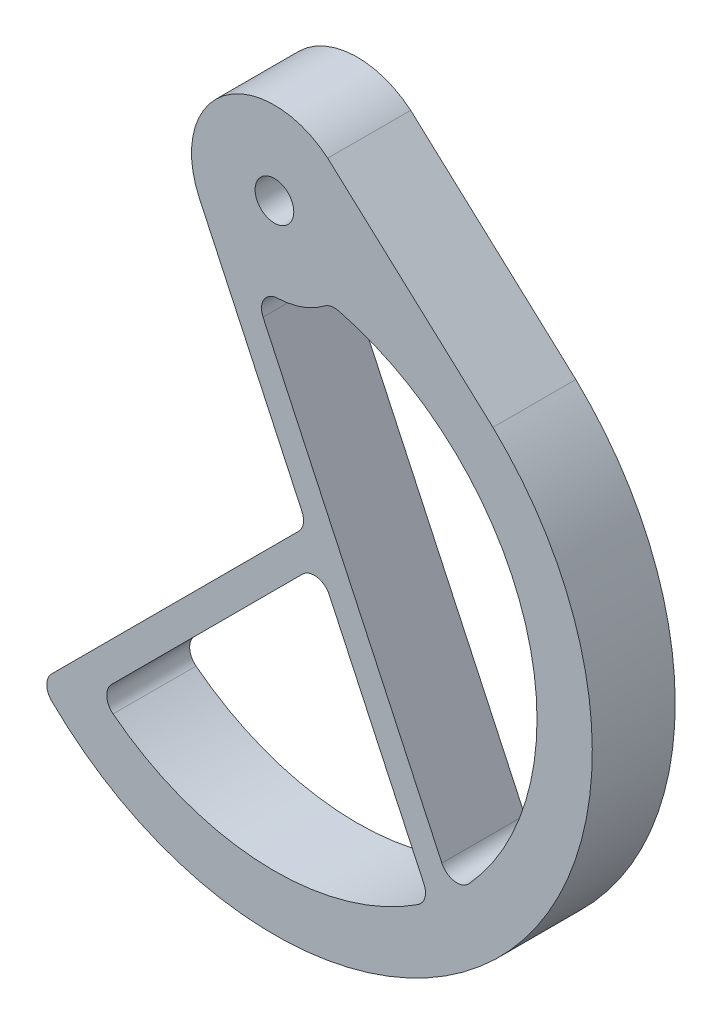
ISO-10303-21;
HEADER;
FILE_DESCRIPTION(('STEP AP214'),'2;1');
FILE_NAME('part.step','',(''),(''),'','','');
FILE_SCHEMA(('AUTOMOTIVE_DESIGN { 1 0 10303 214 1 1 1 1 }'));
ENDSEC;
DATA;
#1=APPLICATION_CONTEXT('core data for automotive mechanical design processes');
#2=APPLICATION_PROTOCOL_DEFINITION('international standard','automotive_design',2000,#1);
#3=PRODUCT_CONTEXT('',#1,'mechanical');
#4=PRODUCT('Part','Part','',(#3));
#5=PRODUCT_RELATED_PRODUCT_CATEGORY('part','',(#4));
#6=PRODUCT_DEFINITION_FORMATION('','',#4);
#7=PRODUCT_DEFINITION_CONTEXT('part definition',#1,'design');
#8=PRODUCT_DEFINITION('design','',#6,#7);
#9=PRODUCT_DEFINITION_SHAPE('','',#8);
#10=(LENGTH_UNIT() NAMED_UNIT(*) SI_UNIT(.MILLI.,.METRE.));
#11=(NAMED_UNIT(*) PLANE_ANGLE_UNIT() SI_UNIT($,.RADIAN.));
#12=(NAMED_UNIT(*) SI_UNIT($,.STERADIAN.) SOLID_ANGLE_UNIT());
#13=UNCERTAINTY_MEASURE_WITH_UNIT(LENGTH_MEASURE(1.E-05),#10,'distance_accuracy_value','');
#14=(GEOMETRIC_REPRESENTATION_CONTEXT(3) GLOBAL_UNCERTAINTY_ASSIGNED_CONTEXT((#13)) GLOBAL_UNIT_ASSIGNED_CONTEXT((#10,
#11,#12)) REPRESENTATION_CONTEXT('',''));
#15=CARTESIAN_POINT('',(0.,0.,0.));
#16=DIRECTION('',(0.,0.,1.));
#17=DIRECTION('',(1.,0.,0.));
#18=AXIS2_PLACEMENT_3D('',#15,#16,#17);
#19=CARTESIAN_POINT('',(0.,57.5,0.));
#20=DIRECTION('',(0.,0.,1.));
#21=DIRECTION('',(1.,0.,0.));
#22=AXIS2_PLACEMENT_3D('',#19,#20,#21);
#23=CYLINDRICAL_SURFACE('',#22,3.5);
#24=CARTESIAN_POINT('',(0.,57.5,15.));
#25=DIRECTION('',(0.,0.,1.));
#26=DIRECTION('',(1.,0.,0.));
#27=AXIS2_PLACEMENT_3D('',#24,#25,#26);
#28=CIRCLE('',#27,3.5);
#29=CARTESIAN_POINT('',(3.5,57.5,15.));
#30=VERTEX_POINT('',#29);
#31=EDGE_CURVE('E203',#30,#30,#28,.T.);
#32=ORIENTED_EDGE('',*,*,#31,.T.);
#33=EDGE_LOOP('',(#32));
#34=FACE_BOUND('',#33,.T.);
#35=CARTESIAN_POINT('',(0.,57.5,2.));
#36=DIRECTION('',(0.,0.,-1.));
#37=DIRECTION('',(-1.,0.,0.));
#38=AXIS2_PLACEMENT_3D('',#35,#36,#37);
#39=CIRCLE('',#38,3.5);
#40=CARTESIAN_POINT('',(-3.5,57.5,2.));
#41=VERTEX_POINT('',#40);
#42=EDGE_CURVE('E37',#41,#41,#39,.F.);
#43=ORIENTED_EDGE('',*,*,#42,.F.);
#44=EDGE_LOOP('',(#43));
#45=FACE_BOUND('',#44,.T.);
#46=ADVANCED_FACE('F33',(#34,#45),#23,.F.);
#47=CARTESIAN_POINT('',(8.4291609341208,3.93058229540153,15.));
#48=DIRECTION('',(0.906307787036647,0.422618261740705,0.));
#49=DIRECTION('',(-0.422618261740705,0.906307787036647,0.));
#50=AXIS2_PLACEMENT_3D('',#47,#48,#49);
#51=PLANE('',#50);
#52=DIRECTION('',(0.422618261740705,-0.906307787036647,0.));
#53=VECTOR('',#52,1.);
#54=CARTESIAN_POINT('',(8.4291609341208,3.93058229540153,0.));
#55=LINE('',#54,#53);
#56=CARTESIAN_POINT('',(-13.5946168055502,51.1607260738895,0.));
#57=VERTEX_POINT('',#56);
#58=CARTESIAN_POINT('',(4.98643209632603,11.3135381134901,0.));
#59=VERTEX_POINT('',#58);
#60=EDGE_CURVE('E233',#57,#59,#55,.T.);
#61=ORIENTED_EDGE('',*,*,#60,.T.);
#62=DIRECTION('',(0.,0.,-1.));
#63=VECTOR('',#62,1.);
#64=CARTESIAN_POINT('',(4.98643209632603,11.3135381134901,15.));
#65=LINE('',#64,#63);
#66=CARTESIAN_POINT('',(4.98643209632603,11.3135381134901,15.));
#67=VERTEX_POINT('',#66);
#68=EDGE_CURVE('E11',#67,#59,#65,.T.);
#69=ORIENTED_EDGE('',*,*,#68,.F.);
#70=DIRECTION('',(0.422618261740705,-0.906307787036647,0.));
#71=VECTOR('',#70,1.);
#72=CARTESIAN_POINT('',(8.4291609341208,3.93058229540153,15.));
#73=LINE('',#72,#71);
#74=CARTESIAN_POINT('',(-13.5946168055502,51.1607260738895,15.));
#75=VERTEX_POINT('',#74);
#76=EDGE_CURVE('E332',#75,#67,#73,.T.);
#77=ORIENTED_EDGE('',*,*,#76,.F.);
#78=DIRECTION('',(0.,0.,-1.));
#79=VECTOR('',#78,1.);
#80=CARTESIAN_POINT('',(-13.5946168055502,51.1607260738895,15.));
#81=LINE('',#80,#79);
#82=EDGE_CURVE('E247',#75,#57,#81,.T.);
#83=ORIENTED_EDGE('',*,*,#82,.T.);
#84=EDGE_LOOP('',(#61,#69,#77,#83));
#85=FACE_BOUND('',#84,.T.);
#86=ADVANCED_FACE('F350',(#85),#51,.F.);
#87=CARTESIAN_POINT('',(2.26750873521609,10.045683328268,15.));
#88=DIRECTION('',(0.,0.,-1.));
#89=DIRECTION('',(-1.,0.,0.));
#90=AXIS2_PLACEMENT_3D('',#87,#88,#89);
#91=CYLINDRICAL_SURFACE('',#90,3.);
#92=CARTESIAN_POINT('',(2.26750873521609,10.045683328268,0.));
#93=DIRECTION('',(0.,0.,1.));
#94=DIRECTION('',(1.,0.,0.));
#95=AXIS2_PLACEMENT_3D('',#92,#93,#94);
#96=CIRCLE('',#95,3.);
#97=CARTESIAN_POINT('',(4.38882907877573,7.92436298470834,0.));
#98=VERTEX_POINT('',#97);
#99=EDGE_CURVE('E236',#59,#98,#96,.F.);
#100=ORIENTED_EDGE('',*,*,#99,.T.);
#101=DIRECTION('',(0.,0.,-1.));
#102=VECTOR('',#101,1.);
#103=CARTESIAN_POINT('',(4.38882907877573,7.92436298470834,15.));
#104=LINE('',#103,#102);
#105=CARTESIAN_POINT('',(4.38882907877573,7.92436298470834,15.));
#106=VERTEX_POINT('',#105);
#107=EDGE_CURVE('E43',#106,#98,#104,.T.);
#108=ORIENTED_EDGE('',*,*,#107,.F.);
#109=CARTESIAN_POINT('',(2.26750873521609,10.045683328268,15.));
#110=DIRECTION('',(0.,0.,1.));
#111=DIRECTION('',(1.,0.,0.));
#112=AXIS2_PLACEMENT_3D('',#109,#110,#111);
#113=CIRCLE('',#112,3.);
#114=EDGE_CURVE('E334',#67,#106,#113,.F.);
#115=ORIENTED_EDGE('',*,*,#114,.F.);
#116=ORIENTED_EDGE('',*,*,#68,.T.);
#117=EDGE_LOOP('',(#100,#108,#115,#116));
#118=FACE_BOUND('',#117,.T.);
#119=ADVANCED_FACE('F373',(#118),#91,.F.);
#120=CARTESIAN_POINT('',(-1.7677669529663,1.76776695296629,15.));
#121=DIRECTION('',(0.707106781186549,-0.707106781186546,0.));
#122=DIRECTION('',(0.707106781186546,0.707106781186549,0.));
#123=AXIS2_PLACEMENT_3D('',#120,#121,#122);
#124=PLANE('',#123);
#125=DIRECTION('',(-0.707106781186546,-0.707106781186549,0.));
#126=VECTOR('',#125,1.);
#127=CARTESIAN_POINT('',(-1.7677669529663,1.76776695296629,0.));
#128=LINE('',#127,#126);
#129=CARTESIAN_POINT('',(-40.3034646889616,-36.7679307830292,0.));
#130=VERTEX_POINT('',#129);
#131=EDGE_CURVE('E238',#98,#130,#128,.T.);
#132=ORIENTED_EDGE('',*,*,#131,.T.);
#133=DIRECTION('',(0.,0.,-1.));
#134=VECTOR('',#133,1.);
#135=CARTESIAN_POINT('',(-40.3034646889616,-36.7679307830292,15.));
#136=LINE('',#135,#134);
#137=CARTESIAN_POINT('',(-40.3034646889616,-36.7679307830292,15.));
#138=VERTEX_POINT('',#137);
#139=EDGE_CURVE('E252',#138,#130,#136,.T.);
#140=ORIENTED_EDGE('',*,*,#139,.F.);
#141=DIRECTION('',(-0.707106781186546,-0.707106781186549,0.));
#142=VECTOR('',#141,1.);
#143=CARTESIAN_POINT('',(-1.7677669529663,1.76776695296629,15.));
#144=LINE('',#143,#142);
#145=EDGE_CURVE('E336',#106,#138,#144,.T.);
#146=ORIENTED_EDGE('',*,*,#145,.F.);
#147=ORIENTED_EDGE('',*,*,#107,.T.);
#148=EDGE_LOOP('',(#132,#140,#146,#147));
#149=FACE_BOUND('',#148,.T.);
#150=ADVANCED_FACE('F341',(#149),#124,.F.);
#151=CARTESIAN_POINT('',(-38.1821443454019,-38.8892511265888,15.));
#152=DIRECTION('',(0.,0.,-1.));
#153=DIRECTION('',(-1.,0.,0.));
#154=AXIS2_PLACEMENT_3D('',#151,#152,#153);
#155=CYLINDRICAL_SURFACE('',#154,3.00000000000001);
#156=CARTESIAN_POINT('',(-38.1821443454019,-38.8892511265888,0.));
#157=DIRECTION('',(0.,0.,1.));
#158=DIRECTION('',(1.,0.,0.));
#159=AXIS2_PLACEMENT_3D('',#156,#157,#158);
#160=CIRCLE('',#159,3.00000000000001);
#161=CARTESIAN_POINT('',(-40.2839137589103,-41.0299438491533,0.));
#162=VERTEX_POINT('',#161);
#163=EDGE_CURVE('E240',#130,#162,#160,.T.);
#164=ORIENTED_EDGE('',*,*,#163,.T.);
#165=DIRECTION('',(0.,0.,-1.));
#166=VECTOR('',#165,1.);
#167=CARTESIAN_POINT('',(-40.2839137589103,-41.0299438491533,15.));
#168=LINE('',#167,#166);
#169=CARTESIAN_POINT('',(-40.2839137589103,-41.0299438491533,15.));
#170=VERTEX_POINT('',#169);
#171=EDGE_CURVE('E191',#170,#162,#168,.T.);
#172=ORIENTED_EDGE('',*,*,#171,.F.);
#173=CARTESIAN_POINT('',(-38.1821443454019,-38.8892511265888,15.));
#174=DIRECTION('',(0.,0.,1.));
#175=DIRECTION('',(1.,0.,0.));
#176=AXIS2_PLACEMENT_3D('',#173,#174,#175);
#177=CIRCLE('',#176,3.00000000000001);
#178=EDGE_CURVE('E178',#138,#170,#177,.T.);
#179=ORIENTED_EDGE('',*,*,#178,.F.);
#180=ORIENTED_EDGE('',*,*,#139,.T.);
#181=EDGE_LOOP('',(#164,#172,#179,#180));
#182=FACE_BOUND('',#181,.T.);
#183=ADVANCED_FACE('F345',(#182),#155,.T.);
#184=CARTESIAN_POINT('',(0.,0.,15.));
#185=DIRECTION('',(0.,0.,-1.));
#186=DIRECTION('',(-1.,0.,0.));
#187=AXIS2_PLACEMENT_3D('',#184,#185,#186);
#188=CYLINDRICAL_SURFACE('',#187,57.5);
#189=CARTESIAN_POINT('',(0.,0.,0.));
#190=DIRECTION('',(0.,0.,1.));
#191=DIRECTION('',(1.,0.,0.));
#192=AXIS2_PLACEMENT_3D('',#189,#190,#191);
#193=CIRCLE('',#192,57.5);
#194=CARTESIAN_POINT('',(39.5241066523143,41.7623633590879,0.));
#195=VERTEX_POINT('',#194);
#196=EDGE_CURVE('E187',#162,#195,#193,.T.);
#197=ORIENTED_EDGE('',*,*,#196,.T.);
#198=DIRECTION('',(0.,0.,-1.));
#199=VECTOR('',#198,1.);
#200=CARTESIAN_POINT('',(39.5241066523143,41.7623633590879,15.));
#201=LINE('',#200,#199);
#202=CARTESIAN_POINT('',(39.5241066523143,41.7623633590879,15.));
#203=VERTEX_POINT('',#202);
#204=EDGE_CURVE('E184',#203,#195,#201,.T.);
#205=ORIENTED_EDGE('',*,*,#204,.F.);
#206=CARTESIAN_POINT('',(0.,0.,15.));
#207=DIRECTION('',(0.,0.,1.));
#208=DIRECTION('',(1.,0.,0.));
#209=AXIS2_PLACEMENT_3D('',#206,#207,#208);
#210=CIRCLE('',#209,57.5);
#211=EDGE_CURVE('E172',#170,#203,#210,.T.);
#212=ORIENTED_EDGE('',*,*,#211,.F.);
#213=ORIENTED_EDGE('',*,*,#171,.T.);
#214=EDGE_LOOP('',(#197,#205,#212,#213));
#215=FACE_BOUND('',#214,.T.);
#216=ADVANCED_FACE('F185',(#215),#188,.T.);
#217=CARTESIAN_POINT('',(38.7204724221989,42.4946229922743,15.));
#218=DIRECTION('',(0.673519927701708,0.739169065227087,0.));
#219=DIRECTION('',(-0.739169065227087,0.673519927701708,0.));
#220=AXIS2_PLACEMENT_3D('',#217,#218,#219);
#221=PLANE('',#220);
#222=DIRECTION('',(0.739169065227087,-0.673519927701708,0.));
#223=VECTOR('',#222,1.);
#224=CARTESIAN_POINT('',(38.7204724221989,42.4946229922743,0.));
#225=LINE('',#224,#223);
#226=CARTESIAN_POINT('',(9.64181414529832,68.990666646785,0.));
#227=VERTEX_POINT('',#226);
#228=EDGE_CURVE('E243',#227,#195,#225,.T.);
#229=ORIENTED_EDGE('',*,*,#228,.F.);
#230=DIRECTION('',(0.,0.,-1.));
#231=VECTOR('',#230,1.);
#232=CARTESIAN_POINT('',(9.64181414529832,68.990666646785,15.));
#233=LINE('',#232,#231);
#234=CARTESIAN_POINT('',(9.64181414529832,68.990666646785,15.));
#235=VERTEX_POINT('',#234);
#236=EDGE_CURVE('E113',#235,#227,#233,.T.);
#237=ORIENTED_EDGE('',*,*,#236,.F.);
#238=DIRECTION('',(0.739169065227087,-0.673519927701708,0.));
#239=VECTOR('',#238,1.);
#240=CARTESIAN_POINT('',(38.7204724221989,42.4946229922743,15.));
#241=LINE('',#240,#239);
#242=EDGE_CURVE('E176',#235,#203,#241,.T.);
#243=ORIENTED_EDGE('',*,*,#242,.T.);
#244=ORIENTED_EDGE('',*,*,#204,.T.);
#245=EDGE_LOOP('',(#229,#237,#243,#244));
#246=FACE_BOUND('',#245,.T.);
#247=ADVANCED_FACE('F193',(#246),#221,.T.);
#248=CARTESIAN_POINT('',(1.76776695296647,-1.76776695296644,15.));
#249=DIRECTION('',(0.707106781186552,-0.707106781186543,0.));
#250=DIRECTION('',(0.707106781186543,0.707106781186552,0.));
#251=AXIS2_PLACEMENT_3D('',#248,#249,#250);
#252=PLANE('',#251);
#253=DIRECTION('',(-0.707106781186543,-0.707106781186552,0.));
#254=VECTOR('',#253,1.);
#255=CARTESIAN_POINT('',(1.76776695296647,-1.76776695296644,0.));
#256=LINE('',#255,#254);
#257=CARTESIAN_POINT('',(5.09333895591193,1.55780504997907,0.));
#258=VERTEX_POINT('',#257);
#259=CARTESIAN_POINT('',(-29.4572230390253,-32.9927569449586,0.));
#260=VERTEX_POINT('',#259);
#261=EDGE_CURVE('E215',#258,#260,#256,.T.);
#262=ORIENTED_EDGE('',*,*,#261,.F.);
#263=DIRECTION('',(0.,0.,-1.));
#264=VECTOR('',#263,1.);
#265=CARTESIAN_POINT('',(5.09333895591193,1.55780504997907,15.));
#266=LINE('',#265,#264);
#267=CARTESIAN_POINT('',(5.09333895591193,1.55780504997907,15.));
#268=VERTEX_POINT('',#267);
#269=EDGE_CURVE('E249',#268,#258,#266,.T.);
#270=ORIENTED_EDGE('',*,*,#269,.F.);
#271=DIRECTION('',(-0.707106781186543,-0.707106781186552,0.));
#272=VECTOR('',#271,1.);
#273=CARTESIAN_POINT('',(1.76776695296647,-1.76776695296644,15.));
#274=LINE('',#273,#272);
#275=CARTESIAN_POINT('',(-29.4572230390253,-32.9927569449586,15.));
#276=VERTEX_POINT('',#275);
#277=EDGE_CURVE('E315',#268,#276,#274,.T.);
#278=ORIENTED_EDGE('',*,*,#277,.T.);
#279=DIRECTION('',(0.,0.,-1.));
#280=VECTOR('',#279,1.);
#281=CARTESIAN_POINT('',(-29.4572230390253,-32.9927569449586,15.));
#282=LINE('',#281,#280);
#283=EDGE_CURVE('E257',#276,#260,#282,.T.);
#284=ORIENTED_EDGE('',*,*,#283,.T.);
#285=EDGE_LOOP('',(#262,#270,#278,#284));
#286=FACE_BOUND('',#285,.T.);
#287=ADVANCED_FACE('F438',(#286),#252,.T.);
#288=CARTESIAN_POINT('',(7.21465929947161,-0.56351529358054,15.));
#289=DIRECTION('',(0.,0.,-1.));
#290=DIRECTION('',(-1.,0.,0.));
#291=AXIS2_PLACEMENT_3D('',#288,#289,#290);
#292=CYLINDRICAL_SURFACE('',#291,3.);
#293=CARTESIAN_POINT('',(7.21465929947161,-0.56351529358054,0.));
#294=DIRECTION('',(0.,0.,1.));
#295=DIRECTION('',(1.,0.,0.));
#296=AXIS2_PLACEMENT_3D('',#293,#294,#295);
#297=CIRCLE('',#296,3.);
#298=CARTESIAN_POINT('',(9.93358266058157,0.704339491641551,0.));
#299=VERTEX_POINT('',#298);
#300=EDGE_CURVE('E218',#258,#299,#297,.F.);
#301=ORIENTED_EDGE('',*,*,#300,.T.);
#302=DIRECTION('',(0.,0.,-1.));
#303=VECTOR('',#302,1.);
#304=CARTESIAN_POINT('',(9.93358266058157,0.704339491641551,15.));
#305=LINE('',#304,#303);
#306=CARTESIAN_POINT('',(9.93358266058157,0.704339491641551,15.));
#307=VERTEX_POINT('',#306);
#308=EDGE_CURVE('E266',#307,#299,#305,.T.);
#309=ORIENTED_EDGE('',*,*,#308,.F.);
#310=CARTESIAN_POINT('',(7.21465929947161,-0.56351529358054,15.));
#311=DIRECTION('',(0.,0.,1.));
#312=DIRECTION('',(1.,0.,0.));
#313=AXIS2_PLACEMENT_3D('',#310,#311,#312);
#314=CIRCLE('',#313,3.);
#315=EDGE_CURVE('E318',#268,#307,#314,.F.);
#316=ORIENTED_EDGE('',*,*,#315,.F.);
#317=ORIENTED_EDGE('',*,*,#269,.T.);
#318=EDGE_LOOP('',(#301,#309,#316,#317));
#319=FACE_BOUND('',#318,.T.);
#320=ADVANCED_FACE('F435',(#319),#292,.F.);
#321=CARTESIAN_POINT('',(8.4291609341208,3.93058229540155,15.));
#322=DIRECTION('',(0.906307787036647,0.422618261740706,0.));
#323=DIRECTION('',(-0.422618261740706,0.906307787036647,0.));
#324=AXIS2_PLACEMENT_3D('',#321,#322,#323);
#325=PLANE('',#324);
#326=DIRECTION('',(0.422618261740706,-0.906307787036647,0.));
#327=VECTOR('',#326,1.);
#328=CARTESIAN_POINT('',(8.4291609341208,3.93058229540155,0.));
#329=LINE('',#328,#327);
#330=CARTESIAN_POINT('',(27.0462176339771,-35.9938246369583,0.));
#331=VERTEX_POINT('',#330);
#332=EDGE_CURVE('E221',#299,#331,#329,.T.);
#333=ORIENTED_EDGE('',*,*,#332,.T.);
#334=DIRECTION('',(0.,0.,-1.));
#335=VECTOR('',#334,1.);
#336=CARTESIAN_POINT('',(27.0462176339771,-35.9938246369583,15.));
#337=LINE('',#336,#335);
#338=CARTESIAN_POINT('',(27.0462176339771,-35.9938246369583,15.));
#339=VERTEX_POINT('',#338);
#340=EDGE_CURVE('E263',#339,#331,#337,.T.);
#341=ORIENTED_EDGE('',*,*,#340,.F.);
#342=DIRECTION('',(0.422618261740706,-0.906307787036647,0.));
#343=VECTOR('',#342,1.);
#344=CARTESIAN_POINT('',(8.4291609341208,3.93058229540155,15.));
#345=LINE('',#344,#343);
#346=EDGE_CURVE('E321',#307,#339,#345,.T.);
#347=ORIENTED_EDGE('',*,*,#346,.F.);
#348=ORIENTED_EDGE('',*,*,#308,.T.);
#349=EDGE_LOOP('',(#333,#341,#347,#348));
#350=FACE_BOUND('',#349,.T.);
#351=ADVANCED_FACE('F428',(#350),#325,.F.);
#352=CARTESIAN_POINT('',(24.3272942728671,-37.2616794221804,15.));
#353=DIRECTION('',(0.,0.,-1.));
#354=DIRECTION('',(-1.,0.,0.));
#355=AXIS2_PLACEMENT_3D('',#352,#353,#354);
#356=CYLINDRICAL_SURFACE('',#355,3.);
#357=CARTESIAN_POINT('',(24.3272942728671,-37.2616794221804,0.));
#358=DIRECTION('',(0.,0.,1.));
#359=DIRECTION('',(1.,0.,0.));
#360=AXIS2_PLACEMENT_3D('',#357,#358,#359);
#361=CIRCLE('',#360,3.);
#362=CARTESIAN_POINT('',(25.9673365833975,-39.7737027540128,0.));
#363=VERTEX_POINT('',#362);
#364=EDGE_CURVE('E224',#331,#363,#361,.F.);
#365=ORIENTED_EDGE('',*,*,#364,.T.);
#366=DIRECTION('',(0.,0.,-1.));
#367=VECTOR('',#366,1.);
#368=CARTESIAN_POINT('',(25.9673365833975,-39.7737027540128,15.));
#369=LINE('',#368,#367);
#370=CARTESIAN_POINT('',(25.9673365833975,-39.7737027540128,15.));
#371=VERTEX_POINT('',#370);
#372=EDGE_CURVE('E261',#371,#363,#369,.T.);
#373=ORIENTED_EDGE('',*,*,#372,.F.);
#374=CARTESIAN_POINT('',(24.3272942728671,-37.2616794221804,15.));
#375=DIRECTION('',(0.,0.,1.));
#376=DIRECTION('',(1.,0.,0.));
#377=AXIS2_PLACEMENT_3D('',#374,#375,#376);
#378=CIRCLE('',#377,3.);
#379=EDGE_CURVE('E324',#339,#371,#378,.F.);
#380=ORIENTED_EDGE('',*,*,#379,.F.);
#381=ORIENTED_EDGE('',*,*,#340,.T.);
#382=EDGE_LOOP('',(#365,#373,#380,#381));
#383=FACE_BOUND('',#382,.T.);
#384=ADVANCED_FACE('F422',(#383),#356,.F.);
#385=CARTESIAN_POINT('',(0.,0.,15.));
#386=DIRECTION('',(0.,0.,-1.));
#387=DIRECTION('',(-1.,0.,0.));
#388=AXIS2_PLACEMENT_3D('',#385,#386,#387);
#389=CYLINDRICAL_SURFACE('',#388,47.5000000000002);
#390=CARTESIAN_POINT('',(0.,0.,0.));
#391=DIRECTION('',(0.,0.,1.));
#392=DIRECTION('',(1.,0.,0.));
#393=AXIS2_PLACEMENT_3D('',#390,#391,#392);
#394=CIRCLE('',#393,47.5000000000002);
#395=CARTESIAN_POINT('',(-29.1787725401039,-37.4813184540365,0.));
#396=VERTEX_POINT('',#395);
#397=EDGE_CURVE('E227',#396,#363,#394,.T.);
#398=ORIENTED_EDGE('',*,*,#397,.F.);
#399=DIRECTION('',(0.,0.,-1.));
#400=VECTOR('',#399,1.);
#401=CARTESIAN_POINT('',(-29.1787725401039,-37.4813184540365,15.));
#402=LINE('',#401,#400);
#403=CARTESIAN_POINT('',(-29.1787725401039,-37.4813184540365,15.));
#404=VERTEX_POINT('',#403);
#405=EDGE_CURVE('E259',#404,#396,#402,.T.);
#406=ORIENTED_EDGE('',*,*,#405,.F.);
#407=CARTESIAN_POINT('',(0.,0.,15.));
#408=DIRECTION('',(0.,0.,1.));
#409=DIRECTION('',(1.,0.,0.));
#410=AXIS2_PLACEMENT_3D('',#407,#408,#409);
#411=CIRCLE('',#410,47.5000000000002);
#412=EDGE_CURVE('E326',#404,#371,#411,.T.);
#413=ORIENTED_EDGE('',*,*,#412,.T.);
#414=ORIENTED_EDGE('',*,*,#372,.T.);
#415=EDGE_LOOP('',(#398,#406,#413,#414));
#416=FACE_BOUND('',#415,.T.);
#417=ADVANCED_FACE('F418',(#416),#389,.F.);
#418=CARTESIAN_POINT('',(10.8692173857394,43.1521739130433,15.));
#419=DIRECTION('',(0.,0.,-1.));
#420=DIRECTION('',(-1.,0.,0.));
#421=AXIS2_PLACEMENT_3D('',#418,#419,#420);
#422=CYLINDRICAL_SURFACE('',#421,3.);
#423=CARTESIAN_POINT('',(10.8692173857394,43.1521739130433,0.));
#424=DIRECTION('',(0.,0.,1.));
#425=DIRECTION('',(1.,0.,0.));
#426=AXIS2_PLACEMENT_3D('',#423,#424,#425);
#427=CIRCLE('',#426,3.);
#428=CARTESIAN_POINT('',(11.6019736139915,46.0613092330238,0.));
#429=VERTEX_POINT('',#428);
#430=CARTESIAN_POINT('',(9.05768115478286,45.5434782608694,0.));
#431=VERTEX_POINT('',#430);
#432=EDGE_CURVE('E199',#429,#431,#427,.T.);
#433=ORIENTED_EDGE('',*,*,#432,.F.);
#434=DIRECTION('',(0.,0.,-1.));
#435=VECTOR('',#434,1.);
#436=CARTESIAN_POINT('',(11.6019736139915,46.0613092330238,15.));
#437=LINE('',#436,#435);
#438=CARTESIAN_POINT('',(11.6019736139915,46.0613092330238,15.));
#439=VERTEX_POINT('',#438);
#440=EDGE_CURVE('E124',#439,#429,#437,.T.);
#441=ORIENTED_EDGE('',*,*,#440,.F.);
#442=CARTESIAN_POINT('',(10.8692173857394,43.1521739130433,15.));
#443=DIRECTION('',(0.,0.,1.));
#444=DIRECTION('',(1.,0.,0.));
#445=AXIS2_PLACEMENT_3D('',#442,#443,#444);
#446=CIRCLE('',#445,3.);
#447=CARTESIAN_POINT('',(9.05768115478286,45.5434782608694,15.));
#448=VERTEX_POINT('',#447);
#449=EDGE_CURVE('E246',#439,#448,#446,.T.);
#450=ORIENTED_EDGE('',*,*,#449,.T.);
#451=DIRECTION('',(0.,0.,-1.));
#452=VECTOR('',#451,1.);
#453=CARTESIAN_POINT('',(9.05768115478286,45.5434782608694,15.));
#454=LINE('',#453,#452);
#455=EDGE_CURVE('E195',#448,#431,#454,.T.);
#456=ORIENTED_EDGE('',*,*,#455,.T.);
#457=EDGE_LOOP('',(#433,#441,#450,#456));
#458=FACE_BOUND('',#457,.T.);
#459=ADVANCED_FACE('F35',(#458),#422,.F.);
#460=CARTESIAN_POINT('',(0.,0.,15.));
#461=DIRECTION('',(0.,0.,-1.));
#462=DIRECTION('',(-1.,0.,0.));
#463=AXIS2_PLACEMENT_3D('',#460,#461,#462);
#464=CYLINDRICAL_SURFACE('',#463,47.5);
#465=CARTESIAN_POINT('',(0.,0.,0.));
#466=DIRECTION('',(0.,0.,1.));
#467=DIRECTION('',(1.,0.,0.));
#468=AXIS2_PLACEMENT_3D('',#465,#466,#467);
#469=CIRCLE('',#468,47.5);
#470=CARTESIAN_POINT('',(35.2318363250107,-31.858557863903,0.));
#471=VERTEX_POINT('',#470);
#472=EDGE_CURVE('E202',#471,#429,#469,.T.);
#473=ORIENTED_EDGE('',*,*,#472,.F.);
#474=DIRECTION('',(0.,0.,-1.));
#475=VECTOR('',#474,1.);
#476=CARTESIAN_POINT('',(35.2318363250107,-31.858557863903,15.));
#477=LINE('',#476,#475);
#478=CARTESIAN_POINT('',(35.2318363250107,-31.858557863903,15.));
#479=VERTEX_POINT('',#478);
#480=EDGE_CURVE('E280',#479,#471,#477,.T.);
#481=ORIENTED_EDGE('',*,*,#480,.F.);
#482=CARTESIAN_POINT('',(0.,0.,15.));
#483=DIRECTION('',(0.,0.,1.));
#484=DIRECTION('',(1.,0.,0.));
#485=AXIS2_PLACEMENT_3D('',#482,#483,#484);
#486=CIRCLE('',#485,47.5);
#487=EDGE_CURVE('E286',#479,#439,#486,.T.);
#488=ORIENTED_EDGE('',*,*,#487,.T.);
#489=ORIENTED_EDGE('',*,*,#440,.T.);
#490=EDGE_LOOP('',(#473,#481,#488,#489));
#491=FACE_BOUND('',#490,.T.);
#492=ADVANCED_FACE('F284',(#491),#464,.F.);
#493=CARTESIAN_POINT('',(33.00666771501,-29.846438419867,15.));
#494=DIRECTION('',(0.,0.,-1.));
#495=DIRECTION('',(-1.,0.,0.));
#496=AXIS2_PLACEMENT_3D('',#493,#494,#495);
#497=CYLINDRICAL_SURFACE('',#496,3.);
#498=CARTESIAN_POINT('',(33.00666771501,-29.846438419867,0.));
#499=DIRECTION('',(0.,0.,1.));
#500=DIRECTION('',(1.,0.,0.));
#501=AXIS2_PLACEMENT_3D('',#498,#499,#500);
#502=CIRCLE('',#501,3.);
#503=CARTESIAN_POINT('',(30.2877443539,-31.1142932050891,0.));
#504=VERTEX_POINT('',#503);
#505=EDGE_CURVE('E206',#471,#504,#502,.F.);
#506=ORIENTED_EDGE('',*,*,#505,.T.);
#507=DIRECTION('',(0.,0.,-1.));
#508=VECTOR('',#507,1.);
#509=CARTESIAN_POINT('',(30.2877443539,-31.1142932050891,15.));
#510=LINE('',#509,#508);
#511=CARTESIAN_POINT('',(30.2877443539,-31.1142932050891,15.));
#512=VERTEX_POINT('',#511);
#513=EDGE_CURVE('E277',#512,#504,#510,.T.);
#514=ORIENTED_EDGE('',*,*,#513,.F.);
#515=CARTESIAN_POINT('',(33.00666771501,-29.846438419867,15.));
#516=DIRECTION('',(0.,0.,1.));
#517=DIRECTION('',(1.,0.,0.));
#518=AXIS2_PLACEMENT_3D('',#515,#516,#517);
#519=CIRCLE('',#518,3.);
#520=EDGE_CURVE('E307',#479,#512,#519,.F.);
#521=ORIENTED_EDGE('',*,*,#520,.F.);
#522=ORIENTED_EDGE('',*,*,#480,.T.);
#523=EDGE_LOOP('',(#506,#514,#521,#522));
#524=FACE_BOUND('',#523,.T.);
#525=ADVANCED_FACE('F297',(#524),#497,.F.);
#526=CARTESIAN_POINT('',(12.9606998693037,6.04367360410479,15.));
#527=DIRECTION('',(-0.906307787036651,-0.422618261740698,0.));
#528=DIRECTION('',(0.422618261740698,-0.906307787036651,0.));
#529=AXIS2_PLACEMENT_3D('',#526,#527,#528);
#530=PLANE('',#529);
#531=DIRECTION('',(-0.422618261740698,0.90630778703665,0.));
#532=VECTOR('',#531,1.);
#533=CARTESIAN_POINT('',(12.9606998693037,6.04367360410479,0.));
#534=LINE('',#533,#532);
#535=CARTESIAN_POINT('',(-2.0547468516362,38.2444030117031,0.));
#536=VERTEX_POINT('',#535);
#537=EDGE_CURVE('E208',#504,#536,#534,.T.);
#538=ORIENTED_EDGE('',*,*,#537,.T.);
#539=DIRECTION('',(0.,0.,-1.));
#540=VECTOR('',#539,1.);
#541=CARTESIAN_POINT('',(-2.0547468516362,38.2444030117031,15.));
#542=LINE('',#541,#540);
#543=CARTESIAN_POINT('',(-2.0547468516362,38.2444030117031,15.));
#544=VERTEX_POINT('',#543);
#545=EDGE_CURVE('E274',#544,#536,#542,.T.);
#546=ORIENTED_EDGE('',*,*,#545,.F.);
#547=DIRECTION('',(-0.422618261740698,0.90630778703665,0.));
#548=VECTOR('',#547,1.);
#549=CARTESIAN_POINT('',(12.9606998693037,6.04367360410479,15.));
#550=LINE('',#549,#548);
#551=EDGE_CURVE('E303',#512,#544,#550,.T.);
#552=ORIENTED_EDGE('',*,*,#551,.F.);
#553=ORIENTED_EDGE('',*,*,#513,.T.);
#554=EDGE_LOOP('',(#538,#546,#552,#553));
#555=FACE_BOUND('',#554,.T.);
#556=ADVANCED_FACE('F301',(#555),#530,.F.);
#557=CARTESIAN_POINT('',(0.664176509473749,39.5122577969252,15.));
#558=DIRECTION('',(0.,0.,-1.));
#559=DIRECTION('',(-1.,0.,0.));
#560=AXIS2_PLACEMENT_3D('',#557,#558,#559);
#561=CYLINDRICAL_SURFACE('',#560,3.);
#562=CARTESIAN_POINT('',(0.664176509473749,39.5122577969252,0.));
#563=DIRECTION('',(0.,0.,1.));
#564=DIRECTION('',(1.,0.,0.));
#565=AXIS2_PLACEMENT_3D('',#562,#563,#564);
#566=CIRCLE('',#565,3.);
#567=CARTESIAN_POINT('',(0.553480424561452,42.510214830771,0.));
#568=VERTEX_POINT('',#567);
#569=EDGE_CURVE('E210',#536,#568,#566,.F.);
#570=ORIENTED_EDGE('',*,*,#569,.T.);
#571=DIRECTION('',(0.,0.,-1.));
#572=VECTOR('',#571,1.);
#573=CARTESIAN_POINT('',(0.553480424561452,42.510214830771,15.));
#574=LINE('',#573,#572);
#575=CARTESIAN_POINT('',(0.553480424561452,42.510214830771,15.));
#576=VERTEX_POINT('',#575);
#577=EDGE_CURVE('E271',#576,#568,#574,.T.);
#578=ORIENTED_EDGE('',*,*,#577,.F.);
#579=CARTESIAN_POINT('',(0.664176509473749,39.5122577969252,15.));
#580=DIRECTION('',(0.,0.,1.));
#581=DIRECTION('',(1.,0.,0.));
#582=AXIS2_PLACEMENT_3D('',#579,#580,#581);
#583=CIRCLE('',#582,3.);
#584=EDGE_CURVE('E306',#544,#576,#583,.F.);
#585=ORIENTED_EDGE('',*,*,#584,.F.);
#586=ORIENTED_EDGE('',*,*,#545,.T.);
#587=EDGE_LOOP('',(#570,#578,#585,#586));
#588=FACE_BOUND('',#587,.T.);
#589=ADVANCED_FACE('F401',(#588),#561,.F.);
#590=CARTESIAN_POINT('',(-27.3359026954657,-35.1140772885184,15.));
#591=DIRECTION('',(0.,0.,-1.));
#592=DIRECTION('',(-1.,0.,0.));
#593=AXIS2_PLACEMENT_3D('',#590,#591,#592);
#594=CYLINDRICAL_SURFACE('',#593,3.00000000000001);
#595=CARTESIAN_POINT('',(-27.3359026954657,-35.1140772885184,0.));
#596=DIRECTION('',(0.,0.,1.));
#597=DIRECTION('',(1.,0.,0.));
#598=AXIS2_PLACEMENT_3D('',#595,#596,#597);
#599=CIRCLE('',#598,3.00000000000001);
#600=EDGE_CURVE('E230',#260,#396,#599,.T.);
#601=ORIENTED_EDGE('',*,*,#600,.F.);
#602=ORIENTED_EDGE('',*,*,#283,.F.);
#603=CARTESIAN_POINT('',(-27.3359026954657,-35.1140772885184,15.));
#604=DIRECTION('',(0.,0.,1.));
#605=DIRECTION('',(1.,0.,0.));
#606=AXIS2_PLACEMENT_3D('',#603,#604,#605);
#607=CIRCLE('',#606,3.00000000000001);
#608=EDGE_CURVE('E329',#276,#404,#607,.T.);
#609=ORIENTED_EDGE('',*,*,#608,.T.);
#610=ORIENTED_EDGE('',*,*,#405,.T.);
#611=EDGE_LOOP('',(#601,#602,#609,#610));
#612=FACE_BOUND('',#611,.T.);
#613=ADVANCED_FACE('F362',(#612),#594,.F.);
#614=CARTESIAN_POINT('',(0.,57.5,15.));
#615=DIRECTION('',(0.,0.,-1.));
#616=DIRECTION('',(-1.,0.,0.));
#617=AXIS2_PLACEMENT_3D('',#614,#615,#616);
#618=CYLINDRICAL_SURFACE('',#617,15.0000000000004);
#619=CARTESIAN_POINT('',(0.,57.5,0.));
#620=DIRECTION('',(0.,0.,1.));
#621=DIRECTION('',(1.,0.,0.));
#622=AXIS2_PLACEMENT_3D('',#619,#620,#621);
#623=CIRCLE('',#622,15.0000000000004);
#624=EDGE_CURVE('E212',#568,#431,#623,.T.);
#625=ORIENTED_EDGE('',*,*,#624,.T.);
#626=ORIENTED_EDGE('',*,*,#455,.F.);
#627=CARTESIAN_POINT('',(0.,57.5,15.));
#628=DIRECTION('',(0.,0.,1.));
#629=DIRECTION('',(1.,0.,0.));
#630=AXIS2_PLACEMENT_3D('',#627,#628,#629);
#631=CIRCLE('',#630,15.0000000000004);
#632=EDGE_CURVE('E309',#576,#448,#631,.T.);
#633=ORIENTED_EDGE('',*,*,#632,.F.);
#634=ORIENTED_EDGE('',*,*,#577,.T.);
#635=EDGE_LOOP('',(#625,#626,#633,#634));
#636=FACE_BOUND('',#635,.T.);
#637=ADVANCED_FACE('F354',(#636),#618,.T.);
#638=CARTESIAN_POINT('',(0.,57.5,15.));
#639=DIRECTION('',(0.,0.,-1.));
#640=DIRECTION('',(-1.,0.,0.));
#641=AXIS2_PLACEMENT_3D('',#638,#639,#640);
#642=CYLINDRICAL_SURFACE('',#641,15.0000000000004);
#643=CARTESIAN_POINT('',(0.,57.5,0.));
#644=DIRECTION('',(0.,0.,1.));
#645=DIRECTION('',(1.,0.,0.));
#646=AXIS2_PLACEMENT_3D('',#643,#644,#645);
#647=CIRCLE('',#646,15.0000000000004);
#648=EDGE_CURVE('E116',#227,#57,#647,.T.);
#649=ORIENTED_EDGE('',*,*,#648,.T.);
#650=ORIENTED_EDGE('',*,*,#82,.F.);
#651=CARTESIAN_POINT('',(0.,57.5,15.));
#652=DIRECTION('',(0.,0.,1.));
#653=DIRECTION('',(1.,0.,0.));
#654=AXIS2_PLACEMENT_3D('',#651,#652,#653);
#655=CIRCLE('',#654,15.0000000000004);
#656=EDGE_CURVE('E52',#235,#75,#655,.T.);
#657=ORIENTED_EDGE('',*,*,#656,.F.);
#658=ORIENTED_EDGE('',*,*,#236,.T.);
#659=EDGE_LOOP('',(#649,#650,#657,#658));
#660=FACE_BOUND('',#659,.T.);
#661=ADVANCED_FACE('F352',(#660),#642,.T.);
#662=CARTESIAN_POINT('',(0.,0.,15.));
#663=DIRECTION('',(0.,0.,1.));
#664=DIRECTION('',(1.,0.,0.));
#665=AXIS2_PLACEMENT_3D('',#662,#663,#664);
#666=PLANE('',#665);
#667=ORIENTED_EDGE('',*,*,#31,.F.);
#668=EDGE_LOOP('',(#667));
#669=FACE_BOUND('',#668,.T.);
#670=ORIENTED_EDGE('',*,*,#449,.F.);
#671=ORIENTED_EDGE('',*,*,#487,.F.);
#672=ORIENTED_EDGE('',*,*,#520,.T.);
#673=ORIENTED_EDGE('',*,*,#551,.T.);
#674=ORIENTED_EDGE('',*,*,#584,.T.);
#675=ORIENTED_EDGE('',*,*,#632,.T.);
#676=EDGE_LOOP('',(#670,#671,#672,#673,#674,#675));
#677=FACE_BOUND('',#676,.T.);
#678=ORIENTED_EDGE('',*,*,#277,.F.);
#679=ORIENTED_EDGE('',*,*,#315,.T.);
#680=ORIENTED_EDGE('',*,*,#346,.T.);
#681=ORIENTED_EDGE('',*,*,#379,.T.);
#682=ORIENTED_EDGE('',*,*,#412,.F.);
#683=ORIENTED_EDGE('',*,*,#608,.F.);
#684=EDGE_LOOP('',(#678,#679,#680,#681,#682,#683));
#685=FACE_BOUND('',#684,.T.);
#686=ORIENTED_EDGE('',*,*,#76,.T.);
#687=ORIENTED_EDGE('',*,*,#114,.T.);
#688=ORIENTED_EDGE('',*,*,#145,.T.);
#689=ORIENTED_EDGE('',*,*,#178,.T.);
#690=ORIENTED_EDGE('',*,*,#211,.T.);
#691=ORIENTED_EDGE('',*,*,#242,.F.);
#692=ORIENTED_EDGE('',*,*,#656,.T.);
#693=EDGE_LOOP('',(#686,#687,#688,#689,#690,#691,#692));
#694=FACE_BOUND('',#693,.T.);
#695=ADVANCED_FACE('F174',(#669,#677,#685,#694),#666,.T.);
#696=CARTESIAN_POINT('',(0.,0.,0.));
#697=DIRECTION('',(0.,0.,1.));
#698=DIRECTION('',(1.,0.,0.));
#699=AXIS2_PLACEMENT_3D('',#696,#697,#698);
#700=PLANE('',#699);
#701=CARTESIAN_POINT('',(0.,57.5,0.));
#702=DIRECTION('',(0.,0.,-1.));
#703=DIRECTION('',(-1.,0.,0.));
#704=AXIS2_PLACEMENT_3D('',#701,#702,#703);
#705=CIRCLE('',#704,10.1);
#706=CARTESIAN_POINT('',(-10.1,57.5,0.));
#707=VERTEX_POINT('',#706);
#708=EDGE_CURVE('E389',#707,#707,#705,.T.);
#709=ORIENTED_EDGE('',*,*,#708,.F.);
#710=EDGE_LOOP('',(#709));
#711=FACE_BOUND('',#710,.T.);
#712=ORIENTED_EDGE('',*,*,#432,.T.);
#713=ORIENTED_EDGE('',*,*,#624,.F.);
#714=ORIENTED_EDGE('',*,*,#569,.F.);
#715=ORIENTED_EDGE('',*,*,#537,.F.);
#716=ORIENTED_EDGE('',*,*,#505,.F.);
#717=ORIENTED_EDGE('',*,*,#472,.T.);
#718=EDGE_LOOP('',(#712,#713,#714,#715,#716,#717));
#719=FACE_BOUND('',#718,.T.);
#720=ORIENTED_EDGE('',*,*,#261,.T.);
#721=ORIENTED_EDGE('',*,*,#600,.T.);
#722=ORIENTED_EDGE('',*,*,#397,.T.);
#723=ORIENTED_EDGE('',*,*,#364,.F.);
#724=ORIENTED_EDGE('',*,*,#332,.F.);
#725=ORIENTED_EDGE('',*,*,#300,.F.);
#726=EDGE_LOOP('',(#720,#721,#722,#723,#724,#725));
#727=FACE_BOUND('',#726,.T.);
#728=ORIENTED_EDGE('',*,*,#60,.F.);
#729=ORIENTED_EDGE('',*,*,#648,.F.);
#730=ORIENTED_EDGE('',*,*,#228,.T.);
#731=ORIENTED_EDGE('',*,*,#196,.F.);
#732=ORIENTED_EDGE('',*,*,#163,.F.);
#733=ORIENTED_EDGE('',*,*,#131,.F.);
#734=ORIENTED_EDGE('',*,*,#99,.F.);
#735=EDGE_LOOP('',(#728,#729,#730,#731,#732,#733,#734));
#736=FACE_BOUND('',#735,.T.);
#737=ADVANCED_FACE('F291',(#711,#719,#727,#736),#700,.F.);
#738=CARTESIAN_POINT('',(0.,57.5,2.));
#739=DIRECTION('',(0.,0.,-1.));
#740=DIRECTION('',(-1.,0.,0.));
#741=AXIS2_PLACEMENT_3D('',#738,#739,#740);
#742=PLANE('',#741);
#743=CARTESIAN_POINT('',(0.,57.5,2.));
#744=DIRECTION('',(0.,0.,-1.));
#745=DIRECTION('',(-1.,0.,0.));
#746=AXIS2_PLACEMENT_3D('',#743,#744,#745);
#747=CIRCLE('',#746,10.1);
#748=CARTESIAN_POINT('',(-10.1,57.5,2.));
#749=VERTEX_POINT('',#748);
#750=EDGE_CURVE('E391',#749,#749,#747,.T.);
#751=ORIENTED_EDGE('',*,*,#750,.T.);
#752=EDGE_LOOP('',(#751));
#753=FACE_BOUND('',#752,.T.);
#754=ORIENTED_EDGE('',*,*,#42,.T.);
#755=EDGE_LOOP('',(#754));
#756=FACE_BOUND('',#755,.T.);
#757=ADVANCED_FACE('F381',(#753,#756),#742,.T.);
#758=CARTESIAN_POINT('',(0.,57.5,2.));
#759=DIRECTION('',(0.,0.,-1.));
#760=DIRECTION('',(-1.,0.,0.));
#761=AXIS2_PLACEMENT_3D('',#758,#759,#760);
#762=CYLINDRICAL_SURFACE('',#761,10.1);
#763=ORIENTED_EDGE('',*,*,#750,.F.);
#764=EDGE_LOOP('',(#763));
#765=FACE_BOUND('',#764,.T.);
#766=ORIENTED_EDGE('',*,*,#708,.T.);
#767=EDGE_LOOP('',(#766));
#768=FACE_BOUND('',#767,.T.);
#769=ADVANCED_FACE('F378',(#765,#768),#762,.F.);
#770=CLOSED_SHELL('',(#46,#86,#119,#150,#183,#216,#247,#287,#320,#351,#384,#417,#459,#492,#525,
#556,#589,#613,#637,#661,#695,#737,#757,#769));
#771=MANIFOLD_SOLID_BREP('B2',#770);
#772=ADVANCED_BREP_SHAPE_REPRESENTATION('',(#18,#771),#14);
#773=SHAPE_DEFINITION_REPRESENTATION(#9,#772);
ENDSEC;
END-ISO-10303-21;
